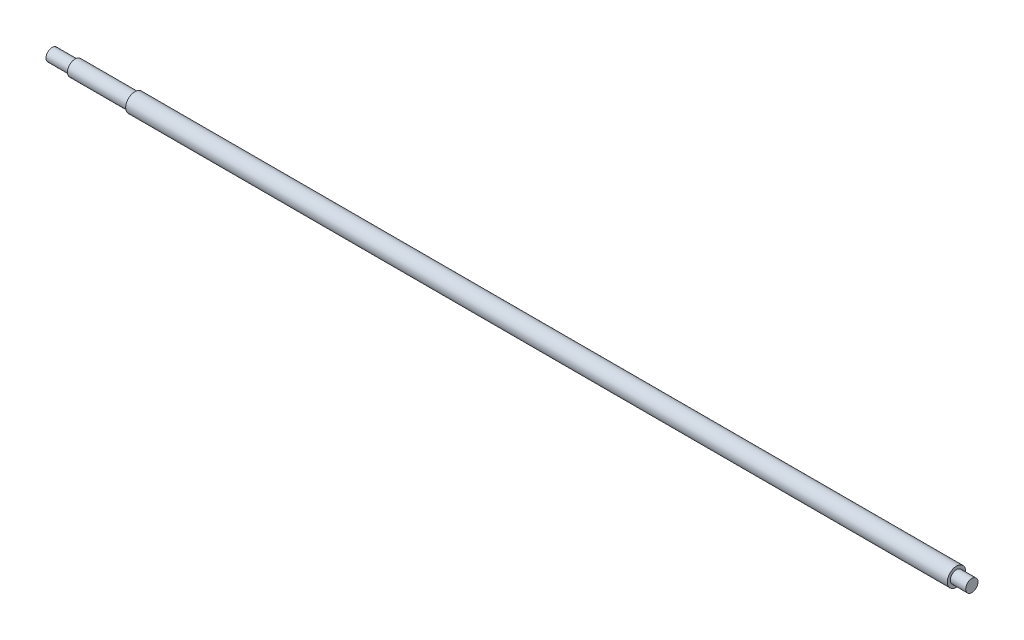
ISO-10303-21;
HEADER;
FILE_DESCRIPTION(('STEP AP214'),'2;1');
FILE_NAME('part.step','',(''),(''),'','','');
FILE_SCHEMA(('AUTOMOTIVE_DESIGN { 1 0 10303 214 1 1 1 1 }'));
ENDSEC;
DATA;
#1=APPLICATION_CONTEXT('core data for automotive mechanical design processes');
#2=APPLICATION_PROTOCOL_DEFINITION('international standard','automotive_design',2000,#1);
#3=PRODUCT_CONTEXT('',#1,'mechanical');
#4=PRODUCT('Part','Part','',(#3));
#5=PRODUCT_RELATED_PRODUCT_CATEGORY('part','',(#4));
#6=PRODUCT_DEFINITION_FORMATION('','',#4);
#7=PRODUCT_DEFINITION_CONTEXT('part definition',#1,'design');
#8=PRODUCT_DEFINITION('design','',#6,#7);
#9=PRODUCT_DEFINITION_SHAPE('','',#8);
#10=(LENGTH_UNIT() NAMED_UNIT(*) SI_UNIT(.MILLI.,.METRE.));
#11=(NAMED_UNIT(*) PLANE_ANGLE_UNIT() SI_UNIT($,.RADIAN.));
#12=(NAMED_UNIT(*) SI_UNIT($,.STERADIAN.) SOLID_ANGLE_UNIT());
#13=UNCERTAINTY_MEASURE_WITH_UNIT(LENGTH_MEASURE(1.E-05),#10,'distance_accuracy_value','');
#14=(GEOMETRIC_REPRESENTATION_CONTEXT(3) GLOBAL_UNCERTAINTY_ASSIGNED_CONTEXT((#13)) GLOBAL_UNIT_ASSIGNED_CONTEXT((#10,
#11,#12)) REPRESENTATION_CONTEXT('',''));
#15=CARTESIAN_POINT('',(0.,0.,0.));
#16=DIRECTION('',(0.,0.,1.));
#17=DIRECTION('',(1.,0.,0.));
#18=AXIS2_PLACEMENT_3D('',#15,#16,#17);
#19=CARTESIAN_POINT('',(0.,0.,0.));
#20=DIRECTION('',(-1.,0.,0.));
#21=DIRECTION('',(0.,0.,1.));
#22=AXIS2_PLACEMENT_3D('',#19,#20,#21);
#23=PLANE('',#22);
#24=CARTESIAN_POINT('',(0.,0.,0.));
#25=DIRECTION('',(1.,0.,0.));
#26=DIRECTION('',(0.,0.,-1.));
#27=AXIS2_PLACEMENT_3D('',#24,#25,#26);
#28=CIRCLE('',#27,3.99999999999999);
#29=CARTESIAN_POINT('',(0.,0.,-3.99999999999999));
#30=VERTEX_POINT('',#29);
#31=EDGE_CURVE('E10',#30,#30,#28,.T.);
#32=ORIENTED_EDGE('',*,*,#31,.F.);
#33=EDGE_LOOP('',(#32));
#34=FACE_BOUND('',#33,.T.);
#35=ADVANCED_FACE('F35',(#34),#23,.T.);
#36=CARTESIAN_POINT('',(600.,0.,0.));
#37=DIRECTION('',(1.,0.,0.));
#38=DIRECTION('',(0.,0.,-1.));
#39=AXIS2_PLACEMENT_3D('',#36,#37,#38);
#40=CYLINDRICAL_SURFACE('',#39,3.99999999999999);
#41=ORIENTED_EDGE('',*,*,#31,.T.);
#42=EDGE_LOOP('',(#41));
#43=FACE_BOUND('',#42,.T.);
#44=CARTESIAN_POINT('',(15.,0.,0.));
#45=DIRECTION('',(1.,0.,0.));
#46=DIRECTION('',(0.,0.,-1.));
#47=AXIS2_PLACEMENT_3D('',#44,#45,#46);
#48=CIRCLE('',#47,3.99999999999999);
#49=CARTESIAN_POINT('',(15.,0.,-3.99999999999999));
#50=VERTEX_POINT('',#49);
#51=EDGE_CURVE('E42',#50,#50,#48,.T.);
#52=ORIENTED_EDGE('',*,*,#51,.F.);
#53=EDGE_LOOP('',(#52));
#54=FACE_BOUND('',#53,.T.);
#55=ADVANCED_FACE('F88',(#43,#54),#40,.T.);
#56=CARTESIAN_POINT('',(15.,3.99999999999999,0.));
#57=DIRECTION('',(-1.,0.,0.));
#58=DIRECTION('',(0.,0.,1.));
#59=AXIS2_PLACEMENT_3D('',#56,#57,#58);
#60=PLANE('',#59);
#61=ORIENTED_EDGE('',*,*,#51,.T.);
#62=EDGE_LOOP('',(#61));
#63=FACE_BOUND('',#62,.T.);
#64=CARTESIAN_POINT('',(15.,0.,0.));
#65=DIRECTION('',(1.,0.,0.));
#66=DIRECTION('',(0.,0.,-1.));
#67=AXIS2_PLACEMENT_3D('',#64,#65,#66);
#68=CIRCLE('',#67,4.99999999999999);
#69=CARTESIAN_POINT('',(15.,0.,-4.99999999999999));
#70=VERTEX_POINT('',#69);
#71=EDGE_CURVE('E49',#70,#70,#68,.T.);
#72=ORIENTED_EDGE('',*,*,#71,.F.);
#73=EDGE_LOOP('',(#72));
#74=FACE_BOUND('',#73,.T.);
#75=ADVANCED_FACE('F93',(#63,#74),#60,.T.);
#76=CARTESIAN_POINT('',(600.,0.,0.));
#77=DIRECTION('',(1.,0.,0.));
#78=DIRECTION('',(0.,0.,-1.));
#79=AXIS2_PLACEMENT_3D('',#76,#77,#78);
#80=CYLINDRICAL_SURFACE('',#79,4.99999999999999);
#81=ORIENTED_EDGE('',*,*,#71,.T.);
#82=EDGE_LOOP('',(#81));
#83=FACE_BOUND('',#82,.T.);
#84=CARTESIAN_POINT('',(54.,0.,0.));
#85=DIRECTION('',(1.,0.,0.));
#86=DIRECTION('',(0.,0.,-1.));
#87=AXIS2_PLACEMENT_3D('',#84,#85,#86);
#88=CIRCLE('',#87,4.99999999999999);
#89=CARTESIAN_POINT('',(54.,0.,-4.99999999999999));
#90=VERTEX_POINT('',#89);
#91=EDGE_CURVE('E54',#90,#90,#88,.T.);
#92=ORIENTED_EDGE('',*,*,#91,.F.);
#93=EDGE_LOOP('',(#92));
#94=FACE_BOUND('',#93,.T.);
#95=ADVANCED_FACE('F97',(#83,#94),#80,.T.);
#96=CARTESIAN_POINT('',(54.,4.99999999999999,0.));
#97=DIRECTION('',(-1.,0.,0.));
#98=DIRECTION('',(0.,0.,1.));
#99=AXIS2_PLACEMENT_3D('',#96,#97,#98);
#100=PLANE('',#99);
#101=ORIENTED_EDGE('',*,*,#91,.T.);
#102=EDGE_LOOP('',(#101));
#103=FACE_BOUND('',#102,.T.);
#104=CARTESIAN_POINT('',(54.,0.,0.));
#105=DIRECTION('',(1.,0.,0.));
#106=DIRECTION('',(0.,0.,-1.));
#107=AXIS2_PLACEMENT_3D('',#104,#105,#106);
#108=CIRCLE('',#107,6.);
#109=CARTESIAN_POINT('',(54.,0.,-6.));
#110=VERTEX_POINT('',#109);
#111=EDGE_CURVE('E59',#110,#110,#108,.T.);
#112=ORIENTED_EDGE('',*,*,#111,.F.);
#113=EDGE_LOOP('',(#112));
#114=FACE_BOUND('',#113,.T.);
#115=ADVANCED_FACE('F103',(#103,#114),#100,.T.);
#116=CARTESIAN_POINT('',(600.,0.,0.));
#117=DIRECTION('',(1.,0.,0.));
#118=DIRECTION('',(0.,0.,-1.));
#119=AXIS2_PLACEMENT_3D('',#116,#117,#118);
#120=CYLINDRICAL_SURFACE('',#119,5.99999999999999);
#121=ORIENTED_EDGE('',*,*,#111,.T.);
#122=EDGE_LOOP('',(#121));
#123=FACE_BOUND('',#122,.T.);
#124=CARTESIAN_POINT('',(590.,0.,0.));
#125=DIRECTION('',(1.,0.,0.));
#126=DIRECTION('',(0.,0.,-1.));
#127=AXIS2_PLACEMENT_3D('',#124,#125,#126);
#128=CIRCLE('',#127,5.99999999999999);
#129=CARTESIAN_POINT('',(590.,0.,-5.99999999999999));
#130=VERTEX_POINT('',#129);
#131=EDGE_CURVE('E62',#130,#130,#128,.T.);
#132=ORIENTED_EDGE('',*,*,#131,.F.);
#133=EDGE_LOOP('',(#132));
#134=FACE_BOUND('',#133,.T.);
#135=ADVANCED_FACE('F84',(#123,#134),#120,.T.);
#136=CARTESIAN_POINT('',(590.,5.99999999999999,0.));
#137=DIRECTION('',(1.,0.,0.));
#138=DIRECTION('',(0.,0.,-1.));
#139=AXIS2_PLACEMENT_3D('',#136,#137,#138);
#140=PLANE('',#139);
#141=ORIENTED_EDGE('',*,*,#131,.T.);
#142=EDGE_LOOP('',(#141));
#143=FACE_BOUND('',#142,.T.);
#144=CARTESIAN_POINT('',(590.,0.,0.));
#145=DIRECTION('',(1.,0.,0.));
#146=DIRECTION('',(0.,0.,-1.));
#147=AXIS2_PLACEMENT_3D('',#144,#145,#146);
#148=CIRCLE('',#147,4.);
#149=CARTESIAN_POINT('',(590.,0.,-4.));
#150=VERTEX_POINT('',#149);
#151=EDGE_CURVE('E65',#150,#150,#148,.T.);
#152=ORIENTED_EDGE('',*,*,#151,.F.);
#153=EDGE_LOOP('',(#152));
#154=FACE_BOUND('',#153,.T.);
#155=ADVANCED_FACE('F76',(#143,#154),#140,.T.);
#156=CARTESIAN_POINT('',(600.,0.,0.));
#157=DIRECTION('',(1.,0.,0.));
#158=DIRECTION('',(0.,0.,-1.));
#159=AXIS2_PLACEMENT_3D('',#156,#157,#158);
#160=CYLINDRICAL_SURFACE('',#159,4.);
#161=ORIENTED_EDGE('',*,*,#151,.T.);
#162=EDGE_LOOP('',(#161));
#163=FACE_BOUND('',#162,.T.);
#164=CARTESIAN_POINT('',(600.,0.,0.));
#165=DIRECTION('',(1.,0.,0.));
#166=DIRECTION('',(0.,0.,-1.));
#167=AXIS2_PLACEMENT_3D('',#164,#165,#166);
#168=CIRCLE('',#167,4.);
#169=CARTESIAN_POINT('',(600.,0.,-4.));
#170=VERTEX_POINT('',#169);
#171=EDGE_CURVE('E68',#170,#170,#168,.T.);
#172=ORIENTED_EDGE('',*,*,#171,.F.);
#173=EDGE_LOOP('',(#172));
#174=FACE_BOUND('',#173,.T.);
#175=ADVANCED_FACE('F74',(#163,#174),#160,.T.);
#176=CARTESIAN_POINT('',(600.,4.,0.));
#177=DIRECTION('',(1.,0.,0.));
#178=DIRECTION('',(0.,0.,-1.));
#179=AXIS2_PLACEMENT_3D('',#176,#177,#178);
#180=PLANE('',#179);
#181=ORIENTED_EDGE('',*,*,#171,.T.);
#182=EDGE_LOOP('',(#181));
#183=FACE_BOUND('',#182,.T.);
#184=ADVANCED_FACE('F72',(#183),#180,.T.);
#185=CLOSED_SHELL('',(#35,#55,#75,#95,#115,#135,#155,#175,#184));
#186=MANIFOLD_SOLID_BREP('B2',#185);
#187=ADVANCED_BREP_SHAPE_REPRESENTATION('',(#18,#186),#14);
#188=SHAPE_DEFINITION_REPRESENTATION(#9,#187);
ENDSEC;
END-ISO-10303-21;
